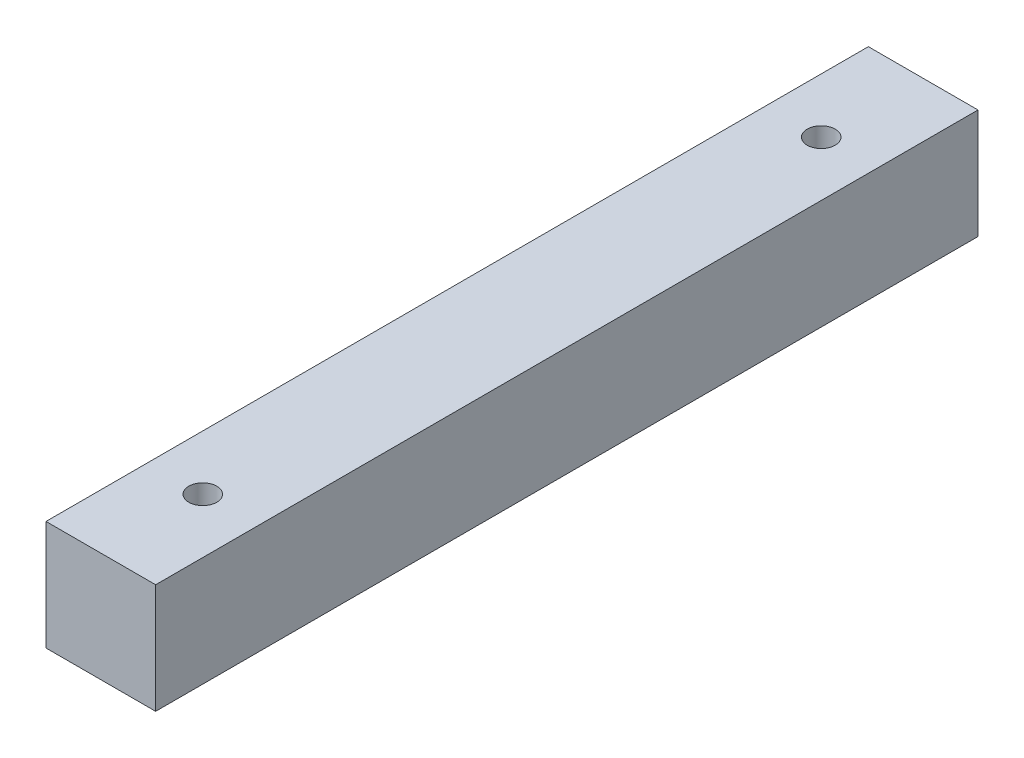
ISO-10303-21;
HEADER;
FILE_DESCRIPTION(('STEP AP214'),'2;1');
FILE_NAME('part.step','',(''),(''),'','','');
FILE_SCHEMA(('AUTOMOTIVE_DESIGN { 1 0 10303 214 1 1 1 1 }'));
ENDSEC;
DATA;
#1=APPLICATION_CONTEXT('core data for automotive mechanical design processes');
#2=APPLICATION_PROTOCOL_DEFINITION('international standard','automotive_design',2000,#1);
#3=PRODUCT_CONTEXT('',#1,'mechanical');
#4=PRODUCT('Part','Part','',(#3));
#5=PRODUCT_RELATED_PRODUCT_CATEGORY('part','',(#4));
#6=PRODUCT_DEFINITION_FORMATION('','',#4);
#7=PRODUCT_DEFINITION_CONTEXT('part definition',#1,'design');
#8=PRODUCT_DEFINITION('design','',#6,#7);
#9=PRODUCT_DEFINITION_SHAPE('','',#8);
#10=(LENGTH_UNIT() NAMED_UNIT(*) SI_UNIT(.MILLI.,.METRE.));
#11=(NAMED_UNIT(*) PLANE_ANGLE_UNIT() SI_UNIT($,.RADIAN.));
#12=(NAMED_UNIT(*) SI_UNIT($,.STERADIAN.) SOLID_ANGLE_UNIT());
#13=UNCERTAINTY_MEASURE_WITH_UNIT(LENGTH_MEASURE(1.E-05),#10,'distance_accuracy_value','');
#14=(GEOMETRIC_REPRESENTATION_CONTEXT(3) GLOBAL_UNCERTAINTY_ASSIGNED_CONTEXT((#13)) GLOBAL_UNIT_ASSIGNED_CONTEXT((#10,
#11,#12)) REPRESENTATION_CONTEXT('',''));
#15=CARTESIAN_POINT('',(0.,0.,0.));
#16=DIRECTION('',(0.,0.,1.));
#17=DIRECTION('',(1.,0.,0.));
#18=AXIS2_PLACEMENT_3D('',#15,#16,#17);
#19=CARTESIAN_POINT('',(10.,10.,150.));
#20=DIRECTION('',(-1.,0.,0.));
#21=DIRECTION('',(0.,0.,1.));
#22=AXIS2_PLACEMENT_3D('',#19,#20,#21);
#23=PLANE('',#22);
#24=DIRECTION('',(0.,1.,0.));
#25=VECTOR('',#24,1.);
#26=CARTESIAN_POINT('',(10.,10.,0.));
#27=LINE('',#26,#25);
#28=CARTESIAN_POINT('',(10.,-10.,0.));
#29=VERTEX_POINT('',#28);
#30=CARTESIAN_POINT('',(10.,10.,0.));
#31=VERTEX_POINT('',#30);
#32=EDGE_CURVE('E99',#29,#31,#27,.T.);
#33=ORIENTED_EDGE('',*,*,#32,.T.);
#34=DIRECTION('',(0.,0.,-1.));
#35=VECTOR('',#34,1.);
#36=CARTESIAN_POINT('',(10.,10.,150.));
#37=LINE('',#36,#35);
#38=CARTESIAN_POINT('',(10.,10.,150.));
#39=VERTEX_POINT('',#38);
#40=EDGE_CURVE('E11',#39,#31,#37,.T.);
#41=ORIENTED_EDGE('',*,*,#40,.F.);
#42=DIRECTION('',(0.,1.,0.));
#43=VECTOR('',#42,1.);
#44=CARTESIAN_POINT('',(10.,10.,150.));
#45=LINE('',#44,#43);
#46=CARTESIAN_POINT('',(10.,-10.,150.));
#47=VERTEX_POINT('',#46);
#48=EDGE_CURVE('E86',#47,#39,#45,.T.);
#49=ORIENTED_EDGE('',*,*,#48,.F.);
#50=DIRECTION('',(0.,0.,-1.));
#51=VECTOR('',#50,1.);
#52=CARTESIAN_POINT('',(10.,-10.,150.));
#53=LINE('',#52,#51);
#54=EDGE_CURVE('E95',#47,#29,#53,.T.);
#55=ORIENTED_EDGE('',*,*,#54,.T.);
#56=EDGE_LOOP('',(#33,#41,#49,#55));
#57=FACE_BOUND('',#56,.T.);
#58=ADVANCED_FACE('F33',(#57),#23,.F.);
#59=CARTESIAN_POINT('',(-10.,10.,150.));
#60=DIRECTION('',(0.,-1.,0.));
#61=DIRECTION('',(0.,0.,-1.));
#62=AXIS2_PLACEMENT_3D('',#59,#60,#61);
#63=PLANE('',#62);
#64=CARTESIAN_POINT('',(0.,10.,18.6));
#65=DIRECTION('',(0.,1.,0.));
#66=DIRECTION('',(0.,0.,1.));
#67=AXIS2_PLACEMENT_3D('',#64,#65,#66);
#68=CIRCLE('',#67,2.55);
#69=CARTESIAN_POINT('',(0.,10.,21.15));
#70=VERTEX_POINT('',#69);
#71=EDGE_CURVE('E116',#70,#70,#68,.T.);
#72=ORIENTED_EDGE('',*,*,#71,.F.);
#73=EDGE_LOOP('',(#72));
#74=FACE_BOUND('',#73,.T.);
#75=CARTESIAN_POINT('',(0.,10.,131.4));
#76=DIRECTION('',(0.,1.,0.));
#77=DIRECTION('',(0.,0.,1.));
#78=AXIS2_PLACEMENT_3D('',#75,#76,#77);
#79=CIRCLE('',#78,2.55);
#80=CARTESIAN_POINT('',(0.,10.,133.95));
#81=VERTEX_POINT('',#80);
#82=EDGE_CURVE('E108',#81,#81,#79,.T.);
#83=ORIENTED_EDGE('',*,*,#82,.F.);
#84=EDGE_LOOP('',(#83));
#85=FACE_BOUND('',#84,.T.);
#86=DIRECTION('',(-1.,0.,0.));
#87=VECTOR('',#86,1.);
#88=CARTESIAN_POINT('',(-10.,10.,0.));
#89=LINE('',#88,#87);
#90=CARTESIAN_POINT('',(-10.,10.,0.));
#91=VERTEX_POINT('',#90);
#92=EDGE_CURVE('E90',#31,#91,#89,.T.);
#93=ORIENTED_EDGE('',*,*,#92,.T.);
#94=DIRECTION('',(0.,0.,-1.));
#95=VECTOR('',#94,1.);
#96=CARTESIAN_POINT('',(-10.,10.,150.));
#97=LINE('',#96,#95);
#98=CARTESIAN_POINT('',(-10.,10.,150.));
#99=VERTEX_POINT('',#98);
#100=EDGE_CURVE('E42',#99,#91,#97,.T.);
#101=ORIENTED_EDGE('',*,*,#100,.F.);
#102=DIRECTION('',(-1.,0.,0.));
#103=VECTOR('',#102,1.);
#104=CARTESIAN_POINT('',(-10.,10.,150.));
#105=LINE('',#104,#103);
#106=EDGE_CURVE('E81',#39,#99,#105,.T.);
#107=ORIENTED_EDGE('',*,*,#106,.F.);
#108=ORIENTED_EDGE('',*,*,#40,.T.);
#109=EDGE_LOOP('',(#93,#101,#107,#108));
#110=FACE_BOUND('',#109,.T.);
#111=ADVANCED_FACE('F89',(#74,#85,#110),#63,.F.);
#112=CARTESIAN_POINT('',(-10.,10.,150.));
#113=DIRECTION('',(1.,0.,0.));
#114=DIRECTION('',(0.,1.,0.));
#115=AXIS2_PLACEMENT_3D('',#112,#113,#114);
#116=PLANE('',#115);
#117=DIRECTION('',(0.,-1.,0.));
#118=VECTOR('',#117,1.);
#119=CARTESIAN_POINT('',(-10.,10.,0.));
#120=LINE('',#119,#118);
#121=CARTESIAN_POINT('',(-10.,-10.,0.));
#122=VERTEX_POINT('',#121);
#123=EDGE_CURVE('E68',#91,#122,#120,.T.);
#124=ORIENTED_EDGE('',*,*,#123,.T.);
#125=DIRECTION('',(0.,0.,-1.));
#126=VECTOR('',#125,1.);
#127=CARTESIAN_POINT('',(-10.,-10.,150.));
#128=LINE('',#127,#126);
#129=CARTESIAN_POINT('',(-10.,-10.,150.));
#130=VERTEX_POINT('',#129);
#131=EDGE_CURVE('E91',#130,#122,#128,.T.);
#132=ORIENTED_EDGE('',*,*,#131,.F.);
#133=DIRECTION('',(0.,-1.,0.));
#134=VECTOR('',#133,1.);
#135=CARTESIAN_POINT('',(-10.,10.,150.));
#136=LINE('',#135,#134);
#137=EDGE_CURVE('E84',#99,#130,#136,.T.);
#138=ORIENTED_EDGE('',*,*,#137,.F.);
#139=ORIENTED_EDGE('',*,*,#100,.T.);
#140=EDGE_LOOP('',(#124,#132,#138,#139));
#141=FACE_BOUND('',#140,.T.);
#142=ADVANCED_FACE('F93',(#141),#116,.F.);
#143=CARTESIAN_POINT('',(-10.,-10.,150.));
#144=DIRECTION('',(0.,1.,0.));
#145=DIRECTION('',(0.,0.,1.));
#146=AXIS2_PLACEMENT_3D('',#143,#144,#145);
#147=PLANE('',#146);
#148=CARTESIAN_POINT('',(0.,-10.,18.6));
#149=DIRECTION('',(0.,1.,0.));
#150=DIRECTION('',(0.,0.,1.));
#151=AXIS2_PLACEMENT_3D('',#148,#149,#150);
#152=CIRCLE('',#151,2.55);
#153=CARTESIAN_POINT('',(0.,-10.,21.15));
#154=VERTEX_POINT('',#153);
#155=EDGE_CURVE('E36',#154,#154,#152,.T.);
#156=ORIENTED_EDGE('',*,*,#155,.T.);
#157=EDGE_LOOP('',(#156));
#158=FACE_BOUND('',#157,.T.);
#159=CARTESIAN_POINT('',(0.,-10.,131.4));
#160=DIRECTION('',(0.,1.,0.));
#161=DIRECTION('',(0.,0.,1.));
#162=AXIS2_PLACEMENT_3D('',#159,#160,#161);
#163=CIRCLE('',#162,2.55);
#164=CARTESIAN_POINT('',(0.,-10.,133.95));
#165=VERTEX_POINT('',#164);
#166=EDGE_CURVE('E102',#165,#165,#163,.T.);
#167=ORIENTED_EDGE('',*,*,#166,.T.);
#168=EDGE_LOOP('',(#167));
#169=FACE_BOUND('',#168,.T.);
#170=DIRECTION('',(1.,0.,0.));
#171=VECTOR('',#170,1.);
#172=CARTESIAN_POINT('',(-10.,-10.,0.));
#173=LINE('',#172,#171);
#174=EDGE_CURVE('E74',#122,#29,#173,.T.);
#175=ORIENTED_EDGE('',*,*,#174,.T.);
#176=ORIENTED_EDGE('',*,*,#54,.F.);
#177=DIRECTION('',(1.,0.,0.));
#178=VECTOR('',#177,1.);
#179=CARTESIAN_POINT('',(-10.,-10.,150.));
#180=LINE('',#179,#178);
#181=EDGE_CURVE('E51',#130,#47,#180,.T.);
#182=ORIENTED_EDGE('',*,*,#181,.F.);
#183=ORIENTED_EDGE('',*,*,#131,.T.);
#184=EDGE_LOOP('',(#175,#176,#182,#183));
#185=FACE_BOUND('',#184,.T.);
#186=ADVANCED_FACE('F130',(#158,#169,#185),#147,.F.);
#187=CARTESIAN_POINT('',(0.,0.,150.));
#188=DIRECTION('',(0.,0.,1.));
#189=DIRECTION('',(1.,0.,0.));
#190=AXIS2_PLACEMENT_3D('',#187,#188,#189);
#191=PLANE('',#190);
#192=ORIENTED_EDGE('',*,*,#48,.T.);
#193=ORIENTED_EDGE('',*,*,#106,.T.);
#194=ORIENTED_EDGE('',*,*,#137,.T.);
#195=ORIENTED_EDGE('',*,*,#181,.T.);
#196=EDGE_LOOP('',(#192,#193,#194,#195));
#197=FACE_BOUND('',#196,.T.);
#198=ADVANCED_FACE('F82',(#197),#191,.T.);
#199=CARTESIAN_POINT('',(0.,0.,0.));
#200=DIRECTION('',(0.,0.,1.));
#201=DIRECTION('',(1.,0.,0.));
#202=AXIS2_PLACEMENT_3D('',#199,#200,#201);
#203=PLANE('',#202);
#204=ORIENTED_EDGE('',*,*,#32,.F.);
#205=ORIENTED_EDGE('',*,*,#174,.F.);
#206=ORIENTED_EDGE('',*,*,#123,.F.);
#207=ORIENTED_EDGE('',*,*,#92,.F.);
#208=EDGE_LOOP('',(#204,#205,#206,#207));
#209=FACE_BOUND('',#208,.T.);
#210=ADVANCED_FACE('F137',(#209),#203,.F.);
#211=CARTESIAN_POINT('',(0.,-33.,131.4));
#212=DIRECTION('',(0.,1.,0.));
#213=DIRECTION('',(0.,0.,1.));
#214=AXIS2_PLACEMENT_3D('',#211,#212,#213);
#215=CYLINDRICAL_SURFACE('',#214,2.55);
#216=ORIENTED_EDGE('',*,*,#82,.T.);
#217=EDGE_LOOP('',(#216));
#218=FACE_BOUND('',#217,.T.);
#219=ORIENTED_EDGE('',*,*,#166,.F.);
#220=EDGE_LOOP('',(#219));
#221=FACE_BOUND('',#220,.T.);
#222=ADVANCED_FACE('F140',(#218,#221),#215,.F.);
#223=CARTESIAN_POINT('',(0.,-33.,18.6));
#224=DIRECTION('',(0.,1.,0.));
#225=DIRECTION('',(0.,0.,1.));
#226=AXIS2_PLACEMENT_3D('',#223,#224,#225);
#227=CYLINDRICAL_SURFACE('',#226,2.55);
#228=ORIENTED_EDGE('',*,*,#71,.T.);
#229=EDGE_LOOP('',(#228));
#230=FACE_BOUND('',#229,.T.);
#231=ORIENTED_EDGE('',*,*,#155,.F.);
#232=EDGE_LOOP('',(#231));
#233=FACE_BOUND('',#232,.T.);
#234=ADVANCED_FACE('F121',(#230,#233),#227,.F.);
#235=CLOSED_SHELL('',(#58,#111,#142,#186,#198,#210,#222,#234));
#236=MANIFOLD_SOLID_BREP('B2',#235);
#237=ADVANCED_BREP_SHAPE_REPRESENTATION('',(#18,#236),#14);
#238=SHAPE_DEFINITION_REPRESENTATION(#9,#237);
ENDSEC;
END-ISO-10303-21;
